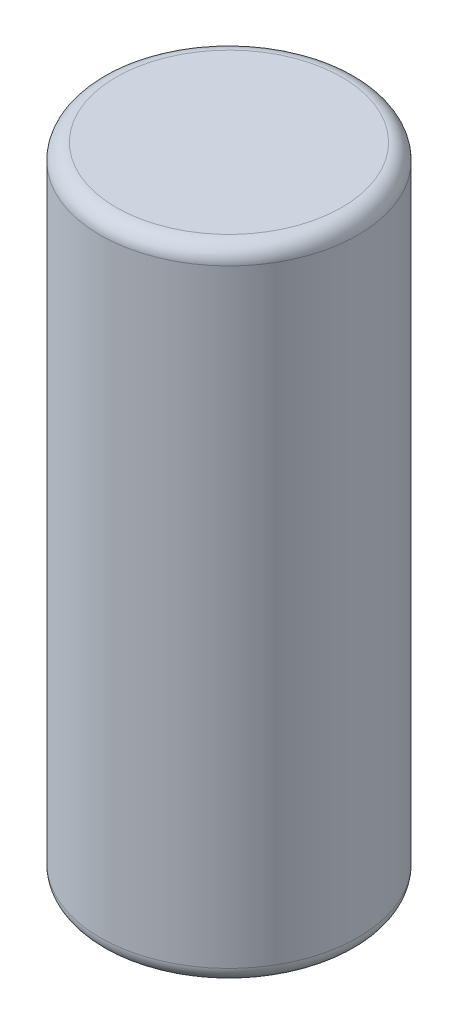
ISO-10303-21;
HEADER;
FILE_DESCRIPTION(('STEP AP214'),'2;1');
FILE_NAME('part.step','',(''),(''),'','','');
FILE_SCHEMA(('AUTOMOTIVE_DESIGN { 1 0 10303 214 1 1 1 1 }'));
ENDSEC;
DATA;
#1=APPLICATION_CONTEXT('core data for automotive mechanical design processes');
#2=APPLICATION_PROTOCOL_DEFINITION('international standard','automotive_design',2000,#1);
#3=PRODUCT_CONTEXT('',#1,'mechanical');
#4=PRODUCT('Part','Part','',(#3));
#5=PRODUCT_RELATED_PRODUCT_CATEGORY('part','',(#4));
#6=PRODUCT_DEFINITION_FORMATION('','',#4);
#7=PRODUCT_DEFINITION_CONTEXT('part definition',#1,'design');
#8=PRODUCT_DEFINITION('design','',#6,#7);
#9=PRODUCT_DEFINITION_SHAPE('','',#8);
#10=(LENGTH_UNIT() NAMED_UNIT(*) SI_UNIT(.MILLI.,.METRE.));
#11=(NAMED_UNIT(*) PLANE_ANGLE_UNIT() SI_UNIT($,.RADIAN.));
#12=(NAMED_UNIT(*) SI_UNIT($,.STERADIAN.) SOLID_ANGLE_UNIT());
#13=UNCERTAINTY_MEASURE_WITH_UNIT(LENGTH_MEASURE(1.E-05),#10,'distance_accuracy_value','');
#14=(GEOMETRIC_REPRESENTATION_CONTEXT(3) GLOBAL_UNCERTAINTY_ASSIGNED_CONTEXT((#13)) GLOBAL_UNIT_ASSIGNED_CONTEXT((#10,
#11,#12)) REPRESENTATION_CONTEXT('',''));
#15=CARTESIAN_POINT('',(0.,0.,0.));
#16=DIRECTION('',(0.,0.,1.));
#17=DIRECTION('',(1.,0.,0.));
#18=AXIS2_PLACEMENT_3D('',#15,#16,#17);
#19=CARTESIAN_POINT('',(0.,20.,0.));
#20=DIRECTION('',(0.,-1.,0.));
#21=DIRECTION('',(0.,0.,-1.));
#22=AXIS2_PLACEMENT_3D('',#19,#20,#21);
#23=CYLINDRICAL_SURFACE('',#22,4.025);
#24=CARTESIAN_POINT('',(0.,0.5,0.));
#25=DIRECTION('',(0.,1.,0.));
#26=DIRECTION('',(0.,0.,1.));
#27=AXIS2_PLACEMENT_3D('',#24,#25,#26);
#28=CIRCLE('',#27,4.025);
#29=CARTESIAN_POINT('',(0.,0.5,4.025));
#30=VERTEX_POINT('',#29);
#31=EDGE_CURVE('E42',#30,#30,#28,.T.);
#32=ORIENTED_EDGE('',*,*,#31,.T.);
#33=EDGE_LOOP('',(#32));
#34=FACE_BOUND('',#33,.T.);
#35=CARTESIAN_POINT('',(0.,19.5,0.));
#36=DIRECTION('',(0.,1.,0.));
#37=DIRECTION('',(0.,0.,1.));
#38=AXIS2_PLACEMENT_3D('',#35,#36,#37);
#39=CIRCLE('',#38,4.025);
#40=CARTESIAN_POINT('',(0.,19.5,4.025));
#41=VERTEX_POINT('',#40);
#42=EDGE_CURVE('E46',#41,#41,#39,.F.);
#43=ORIENTED_EDGE('',*,*,#42,.T.);
#44=EDGE_LOOP('',(#43));
#45=FACE_BOUND('',#44,.T.);
#46=ADVANCED_FACE('F31',(#34,#45),#23,.T.);
#47=CARTESIAN_POINT('',(0.,20.,0.));
#48=DIRECTION('',(0.,1.,0.));
#49=DIRECTION('',(0.,0.,1.));
#50=AXIS2_PLACEMENT_3D('',#47,#48,#49);
#51=PLANE('',#50);
#52=CARTESIAN_POINT('',(0.,20.,0.));
#53=DIRECTION('',(0.,1.,0.));
#54=DIRECTION('',(0.,0.,1.));
#55=AXIS2_PLACEMENT_3D('',#52,#53,#54);
#56=CIRCLE('',#55,3.525);
#57=CARTESIAN_POINT('',(0.,20.,3.525));
#58=VERTEX_POINT('',#57);
#59=EDGE_CURVE('E10',#58,#58,#56,.T.);
#60=ORIENTED_EDGE('',*,*,#59,.T.);
#61=EDGE_LOOP('',(#60));
#62=FACE_BOUND('',#61,.T.);
#63=ADVANCED_FACE('F62',(#62),#51,.T.);
#64=CARTESIAN_POINT('',(0.,0.,0.));
#65=DIRECTION('',(0.,1.,0.));
#66=DIRECTION('',(0.,0.,1.));
#67=AXIS2_PLACEMENT_3D('',#64,#65,#66);
#68=PLANE('',#67);
#69=CARTESIAN_POINT('',(0.,0.,0.));
#70=DIRECTION('',(0.,1.,0.));
#71=DIRECTION('',(0.,0.,1.));
#72=AXIS2_PLACEMENT_3D('',#69,#70,#71);
#73=CIRCLE('',#72,3.525);
#74=CARTESIAN_POINT('',(0.,0.,3.525));
#75=VERTEX_POINT('',#74);
#76=EDGE_CURVE('E38',#75,#75,#73,.F.);
#77=ORIENTED_EDGE('',*,*,#76,.T.);
#78=EDGE_LOOP('',(#77));
#79=FACE_BOUND('',#78,.T.);
#80=ADVANCED_FACE('F59',(#79),#68,.F.);
#81=CARTESIAN_POINT('',(0.,0.5,0.));
#82=DIRECTION('',(0.,1.,0.));
#83=DIRECTION('',(0.,0.,1.));
#84=AXIS2_PLACEMENT_3D('',#81,#82,#83);
#85=TOROIDAL_SURFACE('',#84,3.525,0.5);
#86=ORIENTED_EDGE('',*,*,#76,.F.);
#87=EDGE_LOOP('',(#86));
#88=FACE_BOUND('',#87,.T.);
#89=ORIENTED_EDGE('',*,*,#31,.F.);
#90=EDGE_LOOP('',(#89));
#91=FACE_BOUND('',#90,.T.);
#92=ADVANCED_FACE('F55',(#88,#91),#85,.T.);
#93=CARTESIAN_POINT('',(0.,19.5,0.));
#94=DIRECTION('',(0.,1.,0.));
#95=DIRECTION('',(0.,0.,1.));
#96=AXIS2_PLACEMENT_3D('',#93,#94,#95);
#97=TOROIDAL_SURFACE('',#96,3.525,0.5);
#98=ORIENTED_EDGE('',*,*,#42,.F.);
#99=EDGE_LOOP('',(#98));
#100=FACE_BOUND('',#99,.T.);
#101=ORIENTED_EDGE('',*,*,#59,.F.);
#102=EDGE_LOOP('',(#101));
#103=FACE_BOUND('',#102,.T.);
#104=ADVANCED_FACE('F33',(#100,#103),#97,.T.);
#105=CLOSED_SHELL('',(#46,#63,#80,#92,#104));
#106=MANIFOLD_SOLID_BREP('B2',#105);
#107=ADVANCED_BREP_SHAPE_REPRESENTATION('',(#18,#106),#14);
#108=SHAPE_DEFINITION_REPRESENTATION(#9,#107);
ENDSEC;
END-ISO-10303-21;
